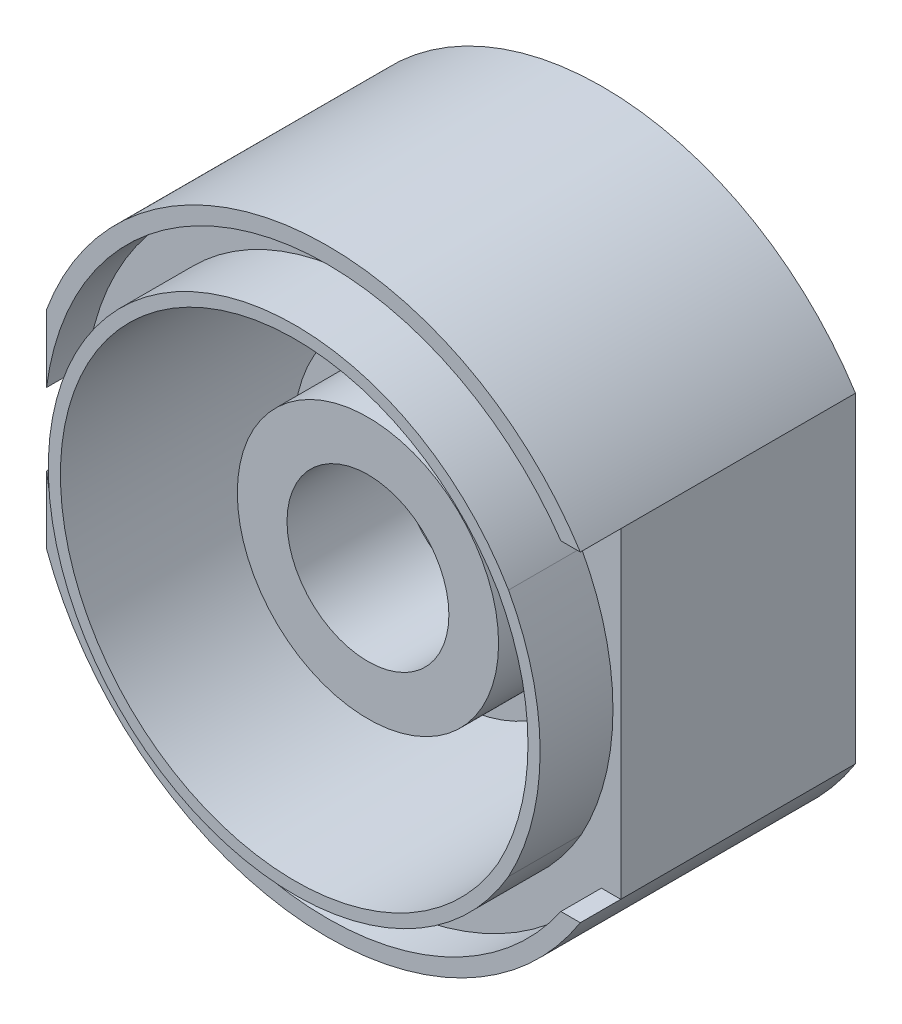
ISO-10303-21;
HEADER;
FILE_DESCRIPTION(('STEP AP214'),'2;1');
FILE_NAME('part.step','',(''),(''),'','','');
FILE_SCHEMA(('AUTOMOTIVE_DESIGN { 1 0 10303 214 1 1 1 1 }'));
ENDSEC;
DATA;
#1=APPLICATION_CONTEXT('core data for automotive mechanical design processes');
#2=APPLICATION_PROTOCOL_DEFINITION('international standard','automotive_design',2000,#1);
#3=PRODUCT_CONTEXT('',#1,'mechanical');
#4=PRODUCT('Part','Part','',(#3));
#5=PRODUCT_RELATED_PRODUCT_CATEGORY('part','',(#4));
#6=PRODUCT_DEFINITION_FORMATION('','',#4);
#7=PRODUCT_DEFINITION_CONTEXT('part definition',#1,'design');
#8=PRODUCT_DEFINITION('design','',#6,#7);
#9=PRODUCT_DEFINITION_SHAPE('','',#8);
#10=(LENGTH_UNIT() NAMED_UNIT(*) SI_UNIT(.MILLI.,.METRE.));
#11=(NAMED_UNIT(*) PLANE_ANGLE_UNIT() SI_UNIT($,.RADIAN.));
#12=(NAMED_UNIT(*) SI_UNIT($,.STERADIAN.) SOLID_ANGLE_UNIT());
#13=UNCERTAINTY_MEASURE_WITH_UNIT(LENGTH_MEASURE(1.E-05),#10,'distance_accuracy_value','');
#14=(GEOMETRIC_REPRESENTATION_CONTEXT(3) GLOBAL_UNCERTAINTY_ASSIGNED_CONTEXT((#13)) GLOBAL_UNIT_ASSIGNED_CONTEXT((#10,
#11,#12)) REPRESENTATION_CONTEXT('',''));
#15=CARTESIAN_POINT('',(0.,0.,0.));
#16=DIRECTION('',(0.,0.,1.));
#17=DIRECTION('',(1.,0.,0.));
#18=AXIS2_PLACEMENT_3D('',#15,#16,#17);
#19=CARTESIAN_POINT('',(2.2573687458903,0.,17.));
#20=DIRECTION('',(0.,0.,-1.));
#21=DIRECTION('',(-1.,0.,0.));
#22=AXIS2_PLACEMENT_3D('',#19,#20,#21);
#23=CYLINDRICAL_SURFACE('',#22,18.5);
#24=DIRECTION('',(0.,0.,-1.));
#25=VECTOR('',#24,1.);
#26=CARTESIAN_POINT('',(-15.1000822737096,6.40069481401747,17.));
#27=LINE('',#26,#25);
#28=CARTESIAN_POINT('',(-15.1000822737096,6.40069481401747,17.));
#29=VERTEX_POINT('',#28);
#30=CARTESIAN_POINT('',(-15.1000822737096,6.40069481401747,0.));
#31=VERTEX_POINT('',#30);
#32=EDGE_CURVE('E165',#29,#31,#27,.T.);
#33=ORIENTED_EDGE('',*,*,#32,.F.);
#34=CARTESIAN_POINT('',(2.2573687458903,0.,17.));
#35=DIRECTION('',(0.,0.,1.));
#36=DIRECTION('',(1.,0.,0.));
#37=AXIS2_PLACEMENT_3D('',#34,#35,#36);
#38=CIRCLE('',#37,18.5);
#39=CARTESIAN_POINT('',(17.8758661637607,9.91526794433595,17.));
#40=VERTEX_POINT('',#39);
#41=EDGE_CURVE('E199',#40,#29,#38,.T.);
#42=ORIENTED_EDGE('',*,*,#41,.F.);
#43=DIRECTION('',(0.,0.,-1.));
#44=VECTOR('',#43,1.);
#45=CARTESIAN_POINT('',(17.8758661637607,9.91526794433595,17.));
#46=LINE('',#45,#44);
#47=CARTESIAN_POINT('',(17.8758661637607,9.91526794433595,14.5));
#48=VERTEX_POINT('',#47);
#49=EDGE_CURVE('E203',#40,#48,#46,.T.);
#50=ORIENTED_EDGE('',*,*,#49,.T.);
#51=CARTESIAN_POINT('',(17.8758661637607,9.91526794433595,0.));
#52=VERTEX_POINT('',#51);
#53=EDGE_CURVE('E208',#48,#52,#46,.T.);
#54=ORIENTED_EDGE('',*,*,#53,.T.);
#55=CARTESIAN_POINT('',(2.2573687458903,0.,0.));
#56=DIRECTION('',(0.,0.,1.));
#57=DIRECTION('',(1.,0.,0.));
#58=AXIS2_PLACEMENT_3D('',#55,#56,#57);
#59=CIRCLE('',#58,18.5);
#60=EDGE_CURVE('E189',#52,#31,#59,.T.);
#61=ORIENTED_EDGE('',*,*,#60,.T.);
#62=EDGE_LOOP('',(#33,#42,#50,#54,#61));
#63=FACE_BOUND('',#62,.T.);
#64=ADVANCED_FACE('F65',(#63),#23,.T.);
#65=DIRECTION('',(0.,0.,-1.));
#66=VECTOR('',#65,1.);
#67=CARTESIAN_POINT('',(-15.1000822737096,-6.40069481401748,17.));
#68=LINE('',#67,#66);
#69=CARTESIAN_POINT('',(-15.1000822737096,-6.40069481401748,0.));
#70=VERTEX_POINT('',#69);
#71=CARTESIAN_POINT('',(-15.1000822737096,-6.40069481401748,17.));
#72=VERTEX_POINT('',#71);
#73=EDGE_CURVE('E162',#70,#72,#68,.F.);
#74=ORIENTED_EDGE('',*,*,#73,.F.);
#75=CARTESIAN_POINT('',(17.8758661637607,-9.91526794433595,0.));
#76=VERTEX_POINT('',#75);
#77=EDGE_CURVE('E177',#70,#76,#59,.T.);
#78=ORIENTED_EDGE('',*,*,#77,.T.);
#79=DIRECTION('',(0.,0.,-1.));
#80=VECTOR('',#79,1.);
#81=CARTESIAN_POINT('',(17.8758661637607,-9.91526794433595,17.));
#82=LINE('',#81,#80);
#83=CARTESIAN_POINT('',(17.8758661637607,-9.91526794433595,14.5));
#84=VERTEX_POINT('',#83);
#85=EDGE_CURVE('E207',#84,#76,#82,.T.);
#86=ORIENTED_EDGE('',*,*,#85,.F.);
#87=CARTESIAN_POINT('',(17.8758661637607,-9.91526794433595,17.));
#88=VERTEX_POINT('',#87);
#89=EDGE_CURVE('E73',#88,#84,#82,.T.);
#90=ORIENTED_EDGE('',*,*,#89,.F.);
#91=EDGE_CURVE('E180',#72,#88,#38,.T.);
#92=ORIENTED_EDGE('',*,*,#91,.F.);
#93=EDGE_LOOP('',(#74,#78,#86,#90,#92));
#94=FACE_BOUND('',#93,.T.);
#95=ADVANCED_FACE('F175',(#94),#23,.T.);
#96=CARTESIAN_POINT('',(2.2573687458903,0.,17.));
#97=DIRECTION('',(0.,0.,1.));
#98=DIRECTION('',(1.,0.,0.));
#99=AXIS2_PLACEMENT_3D('',#96,#97,#98);
#100=PLANE('',#99);
#101=ORIENTED_EDGE('',*,*,#41,.T.);
#102=DIRECTION('',(0.,-1.,0.));
#103=VECTOR('',#102,1.);
#104=CARTESIAN_POINT('',(-15.1000822737096,0.,17.));
#105=LINE('',#104,#103);
#106=CARTESIAN_POINT('',(-15.1000822737096,2.22910163567981,17.));
#107=VERTEX_POINT('',#106);
#108=EDGE_CURVE('E182',#29,#107,#105,.T.);
#109=ORIENTED_EDGE('',*,*,#108,.T.);
#110=CARTESIAN_POINT('',(2.2573687458903,0.,17.));
#111=DIRECTION('',(0.,0.,1.));
#112=DIRECTION('',(1.,0.,0.));
#113=AXIS2_PLACEMENT_3D('',#110,#111,#112);
#114=CIRCLE('',#113,17.5);
#115=CARTESIAN_POINT('',(16.6774055555529,9.91526794433595,17.));
#116=VERTEX_POINT('',#115);
#117=EDGE_CURVE('E321',#116,#107,#114,.T.);
#118=ORIENTED_EDGE('',*,*,#117,.F.);
#119=DIRECTION('',(1.,0.,0.));
#120=VECTOR('',#119,1.);
#121=CARTESIAN_POINT('',(15.3758661637607,9.91526794433595,17.));
#122=LINE('',#121,#120);
#123=EDGE_CURVE('E300',#116,#40,#122,.T.);
#124=ORIENTED_EDGE('',*,*,#123,.T.);
#125=EDGE_LOOP('',(#101,#109,#118,#124));
#126=FACE_BOUND('',#125,.T.);
#127=ADVANCED_FACE('F366',(#126),#100,.T.);
#128=CARTESIAN_POINT('',(-15.1000822737096,-2.22910163567981,17.));
#129=VERTEX_POINT('',#128);
#130=CARTESIAN_POINT('',(16.6774055555529,-9.91526794433595,17.));
#131=VERTEX_POINT('',#130);
#132=EDGE_CURVE('E320',#129,#131,#114,.T.);
#133=ORIENTED_EDGE('',*,*,#132,.F.);
#134=EDGE_CURVE('E340',#129,#72,#105,.T.);
#135=ORIENTED_EDGE('',*,*,#134,.T.);
#136=ORIENTED_EDGE('',*,*,#91,.T.);
#137=DIRECTION('',(1.,0.,0.));
#138=VECTOR('',#137,1.);
#139=CARTESIAN_POINT('',(15.3758661637607,-9.91526794433595,17.));
#140=LINE('',#139,#138);
#141=EDGE_CURVE('E299',#131,#88,#140,.T.);
#142=ORIENTED_EDGE('',*,*,#141,.F.);
#143=EDGE_LOOP('',(#133,#135,#136,#142));
#144=FACE_BOUND('',#143,.T.);
#145=ADVANCED_FACE('F339',(#144),#100,.T.);
#146=CARTESIAN_POINT('',(2.2573687458903,0.,0.));
#147=DIRECTION('',(0.,0.,1.));
#148=DIRECTION('',(1.,0.,0.));
#149=AXIS2_PLACEMENT_3D('',#146,#147,#148);
#150=PLANE('',#149);
#151=CARTESIAN_POINT('',(2.2573687458903,0.,0.));
#152=DIRECTION('',(0.,0.,-1.));
#153=DIRECTION('',(-1.,0.,0.));
#154=AXIS2_PLACEMENT_3D('',#151,#152,#153);
#155=CIRCLE('',#154,8.5);
#156=CARTESIAN_POINT('',(-6.2426312541097,0.,0.));
#157=VERTEX_POINT('',#156);
#158=EDGE_CURVE('E216',#157,#157,#155,.T.);
#159=ORIENTED_EDGE('',*,*,#158,.F.);
#160=EDGE_LOOP('',(#159));
#161=FACE_BOUND('',#160,.T.);
#162=DIRECTION('',(0.,1.,0.));
#163=VECTOR('',#162,1.);
#164=CARTESIAN_POINT('',(-15.1000822737096,8.10819314705162,0.));
#165=LINE('',#164,#163);
#166=EDGE_CURVE('E159',#70,#31,#165,.T.);
#167=ORIENTED_EDGE('',*,*,#166,.T.);
#168=ORIENTED_EDGE('',*,*,#60,.F.);
#169=DIRECTION('',(0.,1.,0.));
#170=VECTOR('',#169,1.);
#171=CARTESIAN_POINT('',(17.8758661637607,9.91526794433595,0.));
#172=LINE('',#171,#170);
#173=EDGE_CURVE('E187',#76,#52,#172,.T.);
#174=ORIENTED_EDGE('',*,*,#173,.F.);
#175=ORIENTED_EDGE('',*,*,#77,.F.);
#176=EDGE_LOOP('',(#167,#168,#174,#175));
#177=FACE_BOUND('',#176,.T.);
#178=ADVANCED_FACE('F185',(#161,#177),#150,.F.);
#179=CARTESIAN_POINT('',(2.2573687458903,0.,14.5));
#180=DIRECTION('',(0.,0.,1.));
#181=DIRECTION('',(1.,0.,0.));
#182=AXIS2_PLACEMENT_3D('',#179,#180,#181);
#183=CYLINDRICAL_SURFACE('',#182,17.5);
#184=DIRECTION('',(0.,0.,1.));
#185=VECTOR('',#184,1.);
#186=CARTESIAN_POINT('',(-15.1000822737096,-2.22910163567981,14.5));
#187=LINE('',#186,#185);
#188=CARTESIAN_POINT('',(-15.1000822737096,-2.22910163567981,14.5));
#189=VERTEX_POINT('',#188);
#190=EDGE_CURVE('E80',#129,#189,#187,.F.);
#191=ORIENTED_EDGE('',*,*,#190,.F.);
#192=ORIENTED_EDGE('',*,*,#132,.T.);
#193=DIRECTION('',(0.,0.,1.));
#194=VECTOR('',#193,1.);
#195=CARTESIAN_POINT('',(16.6774055555529,-9.91526794433595,14.5));
#196=LINE('',#195,#194);
#197=CARTESIAN_POINT('',(16.6774055555529,-9.91526794433595,14.5));
#198=VERTEX_POINT('',#197);
#199=EDGE_CURVE('E304',#131,#198,#196,.F.);
#200=ORIENTED_EDGE('',*,*,#199,.T.);
#201=CARTESIAN_POINT('',(2.2573687458903,0.,14.5));
#202=DIRECTION('',(0.,0.,1.));
#203=DIRECTION('',(1.,0.,0.));
#204=AXIS2_PLACEMENT_3D('',#201,#202,#203);
#205=CIRCLE('',#204,17.5);
#206=EDGE_CURVE('E195',#189,#198,#205,.T.);
#207=ORIENTED_EDGE('',*,*,#206,.F.);
#208=EDGE_LOOP('',(#191,#192,#200,#207));
#209=FACE_BOUND('',#208,.T.);
#210=ADVANCED_FACE('F332',(#209),#183,.F.);
#211=DIRECTION('',(0.,0.,1.));
#212=VECTOR('',#211,1.);
#213=CARTESIAN_POINT('',(-15.1000822737096,2.22910163567981,14.5));
#214=LINE('',#213,#212);
#215=CARTESIAN_POINT('',(-15.1000822737096,2.22910163567981,14.5));
#216=VERTEX_POINT('',#215);
#217=EDGE_CURVE('E171',#216,#107,#214,.T.);
#218=ORIENTED_EDGE('',*,*,#217,.F.);
#219=CARTESIAN_POINT('',(16.6774055555529,9.91526794433595,14.5));
#220=VERTEX_POINT('',#219);
#221=EDGE_CURVE('E190',#220,#216,#205,.T.);
#222=ORIENTED_EDGE('',*,*,#221,.F.);
#223=DIRECTION('',(0.,0.,1.));
#224=VECTOR('',#223,1.);
#225=CARTESIAN_POINT('',(16.6774055555529,9.91526794433595,14.5));
#226=LINE('',#225,#224);
#227=EDGE_CURVE('E317',#220,#116,#226,.T.);
#228=ORIENTED_EDGE('',*,*,#227,.T.);
#229=ORIENTED_EDGE('',*,*,#117,.T.);
#230=EDGE_LOOP('',(#218,#222,#228,#229));
#231=FACE_BOUND('',#230,.T.);
#232=ADVANCED_FACE('F358',(#231),#183,.F.);
#233=CARTESIAN_POINT('',(2.2573687458903,0.,14.5));
#234=DIRECTION('',(0.,0.,1.));
#235=DIRECTION('',(1.,0.,0.));
#236=AXIS2_PLACEMENT_3D('',#233,#234,#235);
#237=PLANE('',#236);
#238=CARTESIAN_POINT('',(1.37584539113167,0.,14.5));
#239=DIRECTION('',(0.,0.,1.));
#240=DIRECTION('',(-1.,0.,0.));
#241=AXIS2_PLACEMENT_3D('',#238,#239,#240);
#242=CIRCLE('',#241,16.0182024487757);
#243=CARTESIAN_POINT('',(15.4409254489024,-7.66526794433594,14.5));
#244=VERTEX_POINT('',#243);
#245=CARTESIAN_POINT('',(15.4409254489024,7.66526794433595,14.5));
#246=VERTEX_POINT('',#245);
#247=EDGE_CURVE('E282',#244,#246,#242,.T.);
#248=ORIENTED_EDGE('',*,*,#247,.F.);
#249=CARTESIAN_POINT('',(2.2573687458903,0.,14.5));
#250=DIRECTION('',(0.,0.,1.));
#251=DIRECTION('',(1.,0.,0.));
#252=AXIS2_PLACEMENT_3D('',#249,#250,#251);
#253=CIRCLE('',#252,15.25);
#254=EDGE_CURVE('E87',#246,#244,#253,.T.);
#255=ORIENTED_EDGE('',*,*,#254,.F.);
#256=EDGE_LOOP('',(#248,#255));
#257=FACE_BOUND('',#256,.T.);
#258=ORIENTED_EDGE('',*,*,#221,.T.);
#259=DIRECTION('',(0.,-1.,0.));
#260=VECTOR('',#259,1.);
#261=CARTESIAN_POINT('',(-15.1000822737096,0.,14.5));
#262=LINE('',#261,#260);
#263=EDGE_CURVE('E12',#216,#189,#262,.T.);
#264=ORIENTED_EDGE('',*,*,#263,.T.);
#265=ORIENTED_EDGE('',*,*,#206,.T.);
#266=DIRECTION('',(1.,0.,0.));
#267=VECTOR('',#266,1.);
#268=CARTESIAN_POINT('',(15.3758661637607,-9.91526794433595,14.5));
#269=LINE('',#268,#267);
#270=EDGE_CURVE('E308',#198,#84,#269,.T.);
#271=ORIENTED_EDGE('',*,*,#270,.T.);
#272=DIRECTION('',(0.,1.,0.));
#273=VECTOR('',#272,1.);
#274=CARTESIAN_POINT('',(17.8758661637607,9.91526794433595,14.5));
#275=LINE('',#274,#273);
#276=EDGE_CURVE('E295',#84,#48,#275,.T.);
#277=ORIENTED_EDGE('',*,*,#276,.T.);
#278=DIRECTION('',(1.,0.,0.));
#279=VECTOR('',#278,1.);
#280=CARTESIAN_POINT('',(15.3758661637607,9.91526794433595,14.5));
#281=LINE('',#280,#279);
#282=EDGE_CURVE('E305',#220,#48,#281,.T.);
#283=ORIENTED_EDGE('',*,*,#282,.F.);
#284=EDGE_LOOP('',(#258,#264,#265,#271,#277,#283));
#285=FACE_BOUND('',#284,.T.);
#286=ADVANCED_FACE('F356',(#257,#285),#237,.T.);
#287=CARTESIAN_POINT('',(2.2573687458903,0.,14.5));
#288=DIRECTION('',(0.,0.,1.));
#289=DIRECTION('',(1.,0.,0.));
#290=AXIS2_PLACEMENT_3D('',#287,#288,#289);
#291=CIRCLE('',#290,5.);
#292=CARTESIAN_POINT('',(7.2573687458903,0.,14.5));
#293=VERTEX_POINT('',#292);
#294=EDGE_CURVE('E212',#293,#293,#291,.T.);
#295=ORIENTED_EDGE('',*,*,#294,.F.);
#296=EDGE_LOOP('',(#295));
#297=FACE_BOUND('',#296,.T.);
#298=CARTESIAN_POINT('',(2.2573687458903,0.,14.5));
#299=DIRECTION('',(0.,0.,1.));
#300=DIRECTION('',(1.,0.,0.));
#301=AXIS2_PLACEMENT_3D('',#298,#299,#300);
#302=CIRCLE('',#301,8.07115888196787);
#303=CARTESIAN_POINT('',(10.3285276278582,0.,14.5));
#304=VERTEX_POINT('',#303);
#305=EDGE_CURVE('E238',#304,#304,#302,.T.);
#306=ORIENTED_EDGE('',*,*,#305,.T.);
#307=EDGE_LOOP('',(#306));
#308=FACE_BOUND('',#307,.T.);
#309=ADVANCED_FACE('F512',(#297,#308),#237,.T.);
#310=CARTESIAN_POINT('',(2.2573687458903,0.,2.));
#311=DIRECTION('',(0.,0.,1.));
#312=DIRECTION('',(1.,0.,0.));
#313=AXIS2_PLACEMENT_3D('',#310,#311,#312);
#314=CYLINDRICAL_SURFACE('',#313,9.57115888196787);
#315=CARTESIAN_POINT('',(2.2573687458903,0.,2.));
#316=DIRECTION('',(0.,0.,1.));
#317=DIRECTION('',(1.,0.,0.));
#318=AXIS2_PLACEMENT_3D('',#315,#316,#317);
#319=CIRCLE('',#318,9.57115888196787);
#320=CARTESIAN_POINT('',(11.8285276278582,0.,2.));
#321=VERTEX_POINT('',#320);
#322=EDGE_CURVE('E228',#321,#321,#319,.T.);
#323=ORIENTED_EDGE('',*,*,#322,.T.);
#324=EDGE_LOOP('',(#323));
#325=FACE_BOUND('',#324,.T.);
#326=CARTESIAN_POINT('',(2.2573687458903,0.,9.5));
#327=DIRECTION('',(0.,0.,1.));
#328=DIRECTION('',(1.,0.,0.));
#329=AXIS2_PLACEMENT_3D('',#326,#327,#328);
#330=CIRCLE('',#329,9.57115888196787);
#331=CARTESIAN_POINT('',(11.8285276278582,0.,9.5));
#332=VERTEX_POINT('',#331);
#333=EDGE_CURVE('E225',#332,#332,#330,.F.);
#334=ORIENTED_EDGE('',*,*,#333,.T.);
#335=EDGE_LOOP('',(#334));
#336=FACE_BOUND('',#335,.T.);
#337=ADVANCED_FACE('F480',(#325,#336),#314,.T.);
#338=CARTESIAN_POINT('',(2.2573687458903,0.,34.));
#339=DIRECTION('',(0.,0.,-1.));
#340=DIRECTION('',(-1.,0.,0.));
#341=AXIS2_PLACEMENT_3D('',#338,#339,#340);
#342=CYLINDRICAL_SURFACE('',#341,5.);
#343=ORIENTED_EDGE('',*,*,#294,.T.);
#344=EDGE_LOOP('',(#343));
#345=FACE_BOUND('',#344,.T.);
#346=CARTESIAN_POINT('',(2.2573687458903,0.,7.5));
#347=DIRECTION('',(0.,0.,-1.));
#348=DIRECTION('',(-1.,0.,0.));
#349=AXIS2_PLACEMENT_3D('',#346,#347,#348);
#350=CIRCLE('',#349,5.);
#351=CARTESIAN_POINT('',(-2.7426312541097,0.,7.5));
#352=VERTEX_POINT('',#351);
#353=EDGE_CURVE('E218',#352,#352,#350,.F.);
#354=ORIENTED_EDGE('',*,*,#353,.F.);
#355=EDGE_LOOP('',(#354));
#356=FACE_BOUND('',#355,.T.);
#357=ADVANCED_FACE('F378',(#345,#356),#342,.F.);
#358=CARTESIAN_POINT('',(17.8758661637607,9.91526794433595,17.));
#359=DIRECTION('',(-1.,0.,0.));
#360=DIRECTION('',(0.,0.,1.));
#361=AXIS2_PLACEMENT_3D('',#358,#359,#360);
#362=PLANE('',#361);
#363=ORIENTED_EDGE('',*,*,#53,.F.);
#364=ORIENTED_EDGE('',*,*,#276,.F.);
#365=ORIENTED_EDGE('',*,*,#85,.T.);
#366=ORIENTED_EDGE('',*,*,#173,.T.);
#367=EDGE_LOOP('',(#363,#364,#365,#366));
#368=FACE_BOUND('',#367,.T.);
#369=ADVANCED_FACE('F352',(#368),#362,.F.);
#370=CARTESIAN_POINT('',(15.3758661637607,9.91526794433595,17.));
#371=DIRECTION('',(0.,1.,0.));
#372=DIRECTION('',(0.,0.,1.));
#373=AXIS2_PLACEMENT_3D('',#370,#371,#372);
#374=PLANE('',#373);
#375=ORIENTED_EDGE('',*,*,#282,.T.);
#376=ORIENTED_EDGE('',*,*,#49,.F.);
#377=ORIENTED_EDGE('',*,*,#123,.F.);
#378=ORIENTED_EDGE('',*,*,#227,.F.);
#379=EDGE_LOOP('',(#375,#376,#377,#378));
#380=FACE_BOUND('',#379,.T.);
#381=ADVANCED_FACE('F369',(#380),#374,.F.);
#382=CARTESIAN_POINT('',(15.3758661637607,-9.91526794433595,14.5));
#383=DIRECTION('',(0.,-1.,0.));
#384=DIRECTION('',(0.,0.,-1.));
#385=AXIS2_PLACEMENT_3D('',#382,#383,#384);
#386=PLANE('',#385);
#387=ORIENTED_EDGE('',*,*,#141,.T.);
#388=ORIENTED_EDGE('',*,*,#89,.T.);
#389=ORIENTED_EDGE('',*,*,#270,.F.);
#390=ORIENTED_EDGE('',*,*,#199,.F.);
#391=EDGE_LOOP('',(#387,#388,#389,#390));
#392=FACE_BOUND('',#391,.T.);
#393=ADVANCED_FACE('F338',(#392),#386,.F.);
#394=CARTESIAN_POINT('',(1.81660706851099,0.,19.));
#395=DIRECTION('',(0.,0.,1.));
#396=DIRECTION('',(1.,0.,0.));
#397=AXIS2_PLACEMENT_3D('',#394,#395,#396);
#398=PLANE('',#397);
#399=CARTESIAN_POINT('',(2.2573687458903,0.,19.));
#400=DIRECTION('',(0.,0.,1.));
#401=DIRECTION('',(1.,0.,0.));
#402=AXIS2_PLACEMENT_3D('',#399,#400,#401);
#403=CIRCLE('',#402,15.25);
#404=CARTESIAN_POINT('',(15.4409254489024,7.66526794433595,19.));
#405=VERTEX_POINT('',#404);
#406=CARTESIAN_POINT('',(15.4409254489024,-7.66526794433594,19.));
#407=VERTEX_POINT('',#406);
#408=EDGE_CURVE('E277',#405,#407,#403,.T.);
#409=ORIENTED_EDGE('',*,*,#408,.T.);
#410=CARTESIAN_POINT('',(1.37584539113167,0.,19.));
#411=DIRECTION('',(0.,0.,1.));
#412=DIRECTION('',(-1.,0.,0.));
#413=AXIS2_PLACEMENT_3D('',#410,#411,#412);
#414=CIRCLE('',#413,16.0182024487757);
#415=EDGE_CURVE('E281',#407,#405,#414,.T.);
#416=ORIENTED_EDGE('',*,*,#415,.T.);
#417=EDGE_LOOP('',(#409,#416));
#418=FACE_BOUND('',#417,.T.);
#419=CARTESIAN_POINT('',(1.37584539113167,0.,19.));
#420=DIRECTION('',(0.,0.,1.));
#421=DIRECTION('',(1.,0.,0.));
#422=AXIS2_PLACEMENT_3D('',#419,#420,#421);
#423=CIRCLE('',#422,15.2682024487757);
#424=CARTESIAN_POINT('',(14.7873388666847,-7.297249397684,19.));
#425=VERTEX_POINT('',#424);
#426=CARTESIAN_POINT('',(14.7873388666847,7.29724939768395,19.));
#427=VERTEX_POINT('',#426);
#428=EDGE_CURVE('E268',#425,#427,#423,.T.);
#429=ORIENTED_EDGE('',*,*,#428,.F.);
#430=CARTESIAN_POINT('',(2.2573687458903,0.,19.));
#431=DIRECTION('',(0.,0.,1.));
#432=DIRECTION('',(1.,0.,0.));
#433=AXIS2_PLACEMENT_3D('',#430,#431,#432);
#434=CIRCLE('',#433,14.5);
#435=EDGE_CURVE('E261',#427,#425,#434,.T.);
#436=ORIENTED_EDGE('',*,*,#435,.F.);
#437=EDGE_LOOP('',(#429,#436));
#438=FACE_BOUND('',#437,.T.);
#439=ADVANCED_FACE('F376',(#418,#438),#398,.T.);
#440=CARTESIAN_POINT('',(2.2573687458903,0.,19.));
#441=DIRECTION('',(0.,0.,-1.));
#442=DIRECTION('',(-1.,0.,0.));
#443=AXIS2_PLACEMENT_3D('',#440,#441,#442);
#444=CYLINDRICAL_SURFACE('',#443,15.25);
#445=ORIENTED_EDGE('',*,*,#254,.T.);
#446=DIRECTION('',(0.,0.,-1.));
#447=VECTOR('',#446,1.);
#448=CARTESIAN_POINT('',(15.4409254489024,-7.66526794433594,19.));
#449=LINE('',#448,#447);
#450=EDGE_CURVE('E292',#407,#244,#449,.T.);
#451=ORIENTED_EDGE('',*,*,#450,.F.);
#452=ORIENTED_EDGE('',*,*,#408,.F.);
#453=DIRECTION('',(0.,0.,-1.));
#454=VECTOR('',#453,1.);
#455=CARTESIAN_POINT('',(15.4409254489024,7.66526794433595,19.));
#456=LINE('',#455,#454);
#457=EDGE_CURVE('E285',#405,#246,#456,.T.);
#458=ORIENTED_EDGE('',*,*,#457,.T.);
#459=EDGE_LOOP('',(#445,#451,#452,#458));
#460=FACE_BOUND('',#459,.T.);
#461=ADVANCED_FACE('F429',(#460),#444,.T.);
#462=CARTESIAN_POINT('',(1.37584539113167,0.,19.));
#463=DIRECTION('',(0.,0.,-1.));
#464=DIRECTION('',(-1.,0.,0.));
#465=AXIS2_PLACEMENT_3D('',#462,#463,#464);
#466=CYLINDRICAL_SURFACE('',#465,16.0182024487757);
#467=ORIENTED_EDGE('',*,*,#247,.T.);
#468=ORIENTED_EDGE('',*,*,#457,.F.);
#469=ORIENTED_EDGE('',*,*,#415,.F.);
#470=ORIENTED_EDGE('',*,*,#450,.T.);
#471=EDGE_LOOP('',(#467,#468,#469,#470));
#472=FACE_BOUND('',#471,.T.);
#473=ADVANCED_FACE('F425',(#472),#466,.T.);
#474=CARTESIAN_POINT('',(2.2573687458903,0.,19.));
#475=DIRECTION('',(0.,0.,-1.));
#476=DIRECTION('',(-1.,0.,0.));
#477=AXIS2_PLACEMENT_3D('',#474,#475,#476);
#478=CYLINDRICAL_SURFACE('',#477,14.5);
#479=DIRECTION('',(0.,0.,-1.));
#480=VECTOR('',#479,1.);
#481=CARTESIAN_POINT('',(14.7873388666847,-7.297249397684,19.));
#482=LINE('',#481,#480);
#483=CARTESIAN_POINT('',(14.7873388666847,-7.297249397684,2.));
#484=VERTEX_POINT('',#483);
#485=EDGE_CURVE('E274',#425,#484,#482,.T.);
#486=ORIENTED_EDGE('',*,*,#485,.T.);
#487=CARTESIAN_POINT('',(2.2573687458903,0.,2.));
#488=DIRECTION('',(0.,0.,1.));
#489=DIRECTION('',(1.,0.,0.));
#490=AXIS2_PLACEMENT_3D('',#487,#488,#489);
#491=CIRCLE('',#490,14.5);
#492=CARTESIAN_POINT('',(14.7873388666847,7.29724939768395,2.));
#493=VERTEX_POINT('',#492);
#494=EDGE_CURVE('E250',#493,#484,#491,.T.);
#495=ORIENTED_EDGE('',*,*,#494,.F.);
#496=DIRECTION('',(0.,0.,-1.));
#497=VECTOR('',#496,1.);
#498=CARTESIAN_POINT('',(14.7873388666847,7.29724939768395,19.));
#499=LINE('',#498,#497);
#500=EDGE_CURVE('E271',#427,#493,#499,.T.);
#501=ORIENTED_EDGE('',*,*,#500,.F.);
#502=ORIENTED_EDGE('',*,*,#435,.T.);
#503=EDGE_LOOP('',(#486,#495,#501,#502));
#504=FACE_BOUND('',#503,.T.);
#505=ADVANCED_FACE('F417',(#504),#478,.F.);
#506=CARTESIAN_POINT('',(1.37584539113167,0.,19.));
#507=DIRECTION('',(0.,0.,-1.));
#508=DIRECTION('',(-1.,0.,0.));
#509=AXIS2_PLACEMENT_3D('',#506,#507,#508);
#510=CYLINDRICAL_SURFACE('',#509,15.2682024487757);
#511=ORIENTED_EDGE('',*,*,#500,.T.);
#512=CARTESIAN_POINT('',(1.37584539113167,0.,2.));
#513=DIRECTION('',(0.,0.,1.));
#514=DIRECTION('',(1.,0.,0.));
#515=AXIS2_PLACEMENT_3D('',#512,#513,#514);
#516=CIRCLE('',#515,15.2682024487757);
#517=EDGE_CURVE('E235',#484,#493,#516,.T.);
#518=ORIENTED_EDGE('',*,*,#517,.F.);
#519=ORIENTED_EDGE('',*,*,#485,.F.);
#520=ORIENTED_EDGE('',*,*,#428,.T.);
#521=EDGE_LOOP('',(#511,#518,#519,#520));
#522=FACE_BOUND('',#521,.T.);
#523=ADVANCED_FACE('F405',(#522),#510,.F.);
#524=CARTESIAN_POINT('',(2.2573687458903,0.,6.5));
#525=DIRECTION('',(0.,0.,-1.));
#526=DIRECTION('',(-1.,0.,0.));
#527=AXIS2_PLACEMENT_3D('',#524,#525,#526);
#528=CYLINDRICAL_SURFACE('',#527,8.5);
#529=CARTESIAN_POINT('',(2.2573687458903,0.,6.5));
#530=DIRECTION('',(0.,0.,-1.));
#531=DIRECTION('',(-1.,0.,0.));
#532=AXIS2_PLACEMENT_3D('',#529,#530,#531);
#533=CIRCLE('',#532,8.5);
#534=CARTESIAN_POINT('',(-6.2426312541097,0.,6.5));
#535=VERTEX_POINT('',#534);
#536=EDGE_CURVE('E257',#535,#535,#533,.T.);
#537=ORIENTED_EDGE('',*,*,#536,.F.);
#538=EDGE_LOOP('',(#537));
#539=FACE_BOUND('',#538,.T.);
#540=ORIENTED_EDGE('',*,*,#158,.T.);
#541=EDGE_LOOP('',(#540));
#542=FACE_BOUND('',#541,.T.);
#543=ADVANCED_FACE('F402',(#539,#542),#528,.F.);
#544=CARTESIAN_POINT('',(2.2573687458903,0.,6.5));
#545=DIRECTION('',(0.,0.,-1.));
#546=DIRECTION('',(-1.,0.,0.));
#547=AXIS2_PLACEMENT_3D('',#544,#545,#546);
#548=PLANE('',#547);
#549=CARTESIAN_POINT('',(2.2573687458903,0.,6.5));
#550=DIRECTION('',(0.,0.,-1.));
#551=DIRECTION('',(-1.,0.,0.));
#552=AXIS2_PLACEMENT_3D('',#549,#550,#551);
#553=CIRCLE('',#552,6.);
#554=CARTESIAN_POINT('',(-3.7426312541097,0.,6.5));
#555=VERTEX_POINT('',#554);
#556=EDGE_CURVE('E217',#555,#555,#553,.T.);
#557=ORIENTED_EDGE('',*,*,#556,.F.);
#558=EDGE_LOOP('',(#557));
#559=FACE_BOUND('',#558,.T.);
#560=ORIENTED_EDGE('',*,*,#536,.T.);
#561=EDGE_LOOP('',(#560));
#562=FACE_BOUND('',#561,.T.);
#563=ADVANCED_FACE('F404',(#559,#562),#548,.T.);
#564=CARTESIAN_POINT('',(2.2573687458903,0.,7.5));
#565=DIRECTION('',(0.,0.,-1.));
#566=DIRECTION('',(-1.,0.,0.));
#567=AXIS2_PLACEMENT_3D('',#564,#565,#566);
#568=PLANE('',#567);
#569=CARTESIAN_POINT('',(2.2573687458903,0.,7.5));
#570=DIRECTION('',(0.,0.,-1.));
#571=DIRECTION('',(-1.,0.,0.));
#572=AXIS2_PLACEMENT_3D('',#569,#570,#571);
#573=CIRCLE('',#572,6.);
#574=CARTESIAN_POINT('',(-3.7426312541097,0.,7.5));
#575=VERTEX_POINT('',#574);
#576=EDGE_CURVE('E222',#575,#575,#573,.T.);
#577=ORIENTED_EDGE('',*,*,#576,.T.);
#578=EDGE_LOOP('',(#577));
#579=FACE_BOUND('',#578,.T.);
#580=ORIENTED_EDGE('',*,*,#353,.T.);
#581=EDGE_LOOP('',(#580));
#582=FACE_BOUND('',#581,.T.);
#583=ADVANCED_FACE('F413',(#579,#582),#568,.T.);
#584=CARTESIAN_POINT('',(2.2573687458903,0.,7.5));
#585=DIRECTION('',(0.,0.,-1.));
#586=DIRECTION('',(-1.,0.,0.));
#587=AXIS2_PLACEMENT_3D('',#584,#585,#586);
#588=CYLINDRICAL_SURFACE('',#587,6.);
#589=ORIENTED_EDGE('',*,*,#556,.T.);
#590=EDGE_LOOP('',(#589));
#591=FACE_BOUND('',#590,.T.);
#592=ORIENTED_EDGE('',*,*,#576,.F.);
#593=EDGE_LOOP('',(#592));
#594=FACE_BOUND('',#593,.T.);
#595=ADVANCED_FACE('F486',(#591,#594),#588,.F.);
#596=CARTESIAN_POINT('',(1.81660706851099,0.,2.));
#597=DIRECTION('',(0.,0.,1.));
#598=DIRECTION('',(1.,0.,0.));
#599=AXIS2_PLACEMENT_3D('',#596,#597,#598);
#600=PLANE('',#599);
#601=ORIENTED_EDGE('',*,*,#322,.F.);
#602=EDGE_LOOP('',(#601));
#603=FACE_BOUND('',#602,.T.);
#604=ORIENTED_EDGE('',*,*,#517,.T.);
#605=ORIENTED_EDGE('',*,*,#494,.T.);
#606=EDGE_LOOP('',(#604,#605));
#607=FACE_BOUND('',#606,.T.);
#608=ADVANCED_FACE('F495',(#603,#607),#600,.T.);
#609=CARTESIAN_POINT('',(2.2573687458903,0.,9.5));
#610=DIRECTION('',(0.,0.,1.));
#611=DIRECTION('',(1.,0.,0.));
#612=AXIS2_PLACEMENT_3D('',#609,#610,#611);
#613=PLANE('',#612);
#614=ORIENTED_EDGE('',*,*,#333,.F.);
#615=EDGE_LOOP('',(#614));
#616=FACE_BOUND('',#615,.T.);
#617=CARTESIAN_POINT('',(2.2573687458903,0.,9.5));
#618=DIRECTION('',(0.,0.,1.));
#619=DIRECTION('',(1.,0.,0.));
#620=AXIS2_PLACEMENT_3D('',#617,#618,#619);
#621=CIRCLE('',#620,8.07115888196787);
#622=CARTESIAN_POINT('',(10.3285276278582,0.,9.5));
#623=VERTEX_POINT('',#622);
#624=EDGE_CURVE('E229',#623,#623,#621,.T.);
#625=ORIENTED_EDGE('',*,*,#624,.F.);
#626=EDGE_LOOP('',(#625));
#627=FACE_BOUND('',#626,.T.);
#628=ADVANCED_FACE('F506',(#616,#627),#613,.T.);
#629=CARTESIAN_POINT('',(2.2573687458903,0.,9.5));
#630=DIRECTION('',(0.,0.,1.));
#631=DIRECTION('',(1.,0.,0.));
#632=AXIS2_PLACEMENT_3D('',#629,#630,#631);
#633=CYLINDRICAL_SURFACE('',#632,8.07115888196787);
#634=ORIENTED_EDGE('',*,*,#624,.T.);
#635=EDGE_LOOP('',(#634));
#636=FACE_BOUND('',#635,.T.);
#637=ORIENTED_EDGE('',*,*,#305,.F.);
#638=EDGE_LOOP('',(#637));
#639=FACE_BOUND('',#638,.T.);
#640=ADVANCED_FACE('F528',(#636,#639),#633,.T.);
#641=CARTESIAN_POINT('',(-15.1000822737096,8.10819314705162,31.5));
#642=DIRECTION('',(-1.,0.,0.));
#643=DIRECTION('',(0.,0.,1.));
#644=AXIS2_PLACEMENT_3D('',#641,#642,#643);
#645=PLANE('',#644);
#646=ORIENTED_EDGE('',*,*,#32,.T.);
#647=ORIENTED_EDGE('',*,*,#166,.F.);
#648=ORIENTED_EDGE('',*,*,#73,.T.);
#649=ORIENTED_EDGE('',*,*,#134,.F.);
#650=ORIENTED_EDGE('',*,*,#190,.T.);
#651=ORIENTED_EDGE('',*,*,#263,.F.);
#652=ORIENTED_EDGE('',*,*,#217,.T.);
#653=ORIENTED_EDGE('',*,*,#108,.F.);
#654=EDGE_LOOP('',(#646,#647,#648,#649,#650,#651,#652,#653));
#655=FACE_BOUND('',#654,.T.);
#656=ADVANCED_FACE('F161',(#655),#645,.T.);
#657=CLOSED_SHELL('',(#64,#95,#127,#145,#178,#210,#232,#286,#309,#337,#357,#369,#381,#393,#439,
#461,#473,#505,#523,#543,#563,#583,#595,#608,#628,#640,#656));
#658=MANIFOLD_SOLID_BREP('B2',#657);
#659=ADVANCED_BREP_SHAPE_REPRESENTATION('',(#18,#658),#14);
#660=SHAPE_DEFINITION_REPRESENTATION(#9,#659);
ENDSEC;
END-ISO-10303-21;
